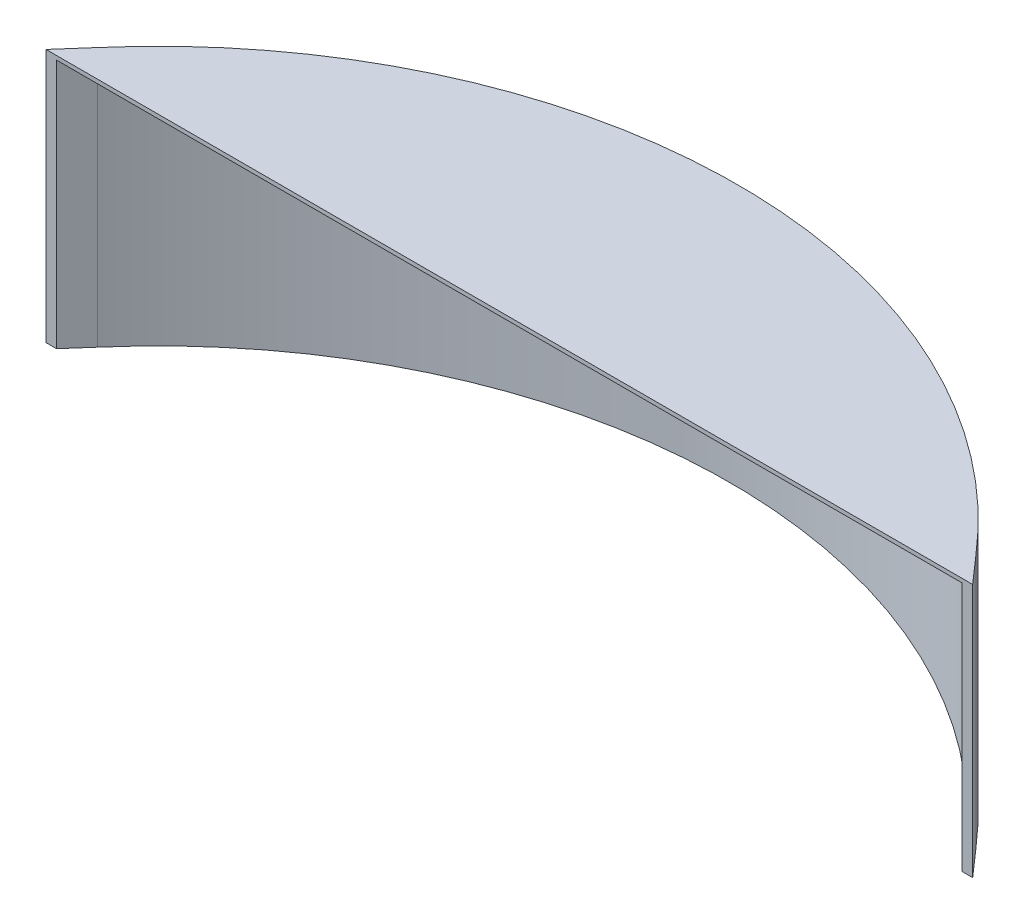
ISO-10303-21;
HEADER;
FILE_DESCRIPTION(('STEP AP214'),'2;1');
FILE_NAME('part.step','',(''),(''),'','','');
FILE_SCHEMA(('AUTOMOTIVE_DESIGN { 1 0 10303 214 1 1 1 1 }'));
ENDSEC;
DATA;
#1=APPLICATION_CONTEXT('core data for automotive mechanical design processes');
#2=APPLICATION_PROTOCOL_DEFINITION('international standard','automotive_design',2000,#1);
#3=PRODUCT_CONTEXT('',#1,'mechanical');
#4=PRODUCT('Part','Part','',(#3));
#5=PRODUCT_RELATED_PRODUCT_CATEGORY('part','',(#4));
#6=PRODUCT_DEFINITION_FORMATION('','',#4);
#7=PRODUCT_DEFINITION_CONTEXT('part definition',#1,'design');
#8=PRODUCT_DEFINITION('design','',#6,#7);
#9=PRODUCT_DEFINITION_SHAPE('','',#8);
#10=(LENGTH_UNIT() NAMED_UNIT(*) SI_UNIT(.MILLI.,.METRE.));
#11=(NAMED_UNIT(*) PLANE_ANGLE_UNIT() SI_UNIT($,.RADIAN.));
#12=(NAMED_UNIT(*) SI_UNIT($,.STERADIAN.) SOLID_ANGLE_UNIT());
#13=UNCERTAINTY_MEASURE_WITH_UNIT(LENGTH_MEASURE(1.E-05),#10,'distance_accuracy_value','');
#14=(GEOMETRIC_REPRESENTATION_CONTEXT(3) GLOBAL_UNCERTAINTY_ASSIGNED_CONTEXT((#13)) GLOBAL_UNIT_ASSIGNED_CONTEXT((#10,
#11,#12)) REPRESENTATION_CONTEXT('',''));
#15=CARTESIAN_POINT('',(0.,0.,0.));
#16=DIRECTION('',(0.,0.,1.));
#17=DIRECTION('',(1.,0.,0.));
#18=AXIS2_PLACEMENT_3D('',#15,#16,#17);
#19=CARTESIAN_POINT('',(-117.504462868261,1.,-326.15564046222));
#20=DIRECTION('',(0.,0.,-1.));
#21=DIRECTION('',(-1.,0.,0.));
#22=AXIS2_PLACEMENT_3D('',#19,#20,#21);
#23=PLANE('',#22);
#24=DIRECTION('',(0.,-1.,0.));
#25=VECTOR('',#24,1.);
#26=CARTESIAN_POINT('',(-117.504462868261,1.,-326.15564046222));
#27=LINE('',#26,#25);
#28=CARTESIAN_POINT('',(-117.504462868261,1.,-326.15564046222));
#29=VERTEX_POINT('',#28);
#30=CARTESIAN_POINT('',(-117.504462868261,-63.399999946,-326.155640462222));
#31=VERTEX_POINT('',#30);
#32=EDGE_CURVE('E98',#29,#31,#27,.T.);
#33=ORIENTED_EDGE('',*,*,#32,.T.);
#34=DIRECTION('',(-1.,0.,0.));
#35=VECTOR('',#34,1.);
#36=CARTESIAN_POINT('',(-117.504462868261,-63.399999946,-326.155640462222));
#37=LINE('',#36,#35);
#38=CARTESIAN_POINT('',(-114.840789939664,-63.399999946,-326.155640462222));
#39=VERTEX_POINT('',#38);
#40=EDGE_CURVE('E102',#39,#31,#37,.T.);
#41=ORIENTED_EDGE('',*,*,#40,.F.);
#42=DIRECTION('',(0.,1.,0.));
#43=VECTOR('',#42,1.);
#44=CARTESIAN_POINT('',(-114.840789939664,-63.399999946,-326.155640462222));
#45=LINE('',#44,#43);
#46=CARTESIAN_POINT('',(-114.840789939666,0.,-326.15564046222));
#47=VERTEX_POINT('',#46);
#48=EDGE_CURVE('E139',#39,#47,#45,.T.);
#49=ORIENTED_EDGE('',*,*,#48,.T.);
#50=DIRECTION('',(1.,0.,0.));
#51=VECTOR('',#50,1.);
#52=CARTESIAN_POINT('',(-117.504462868261,0.,-326.15564046222));
#53=LINE('',#52,#51);
#54=CARTESIAN_POINT('',(114.840789939671,0.,-326.155640462222));
#55=VERTEX_POINT('',#54);
#56=EDGE_CURVE('E152',#47,#55,#53,.T.);
#57=ORIENTED_EDGE('',*,*,#56,.T.);
#58=DIRECTION('',(0.,1.,0.));
#59=VECTOR('',#58,1.);
#60=CARTESIAN_POINT('',(114.840789939671,-63.399999946,-326.155640462222));
#61=LINE('',#60,#59);
#62=CARTESIAN_POINT('',(114.840789939671,-63.399999946,-326.155640462222));
#63=VERTEX_POINT('',#62);
#64=EDGE_CURVE('E149',#63,#55,#61,.T.);
#65=ORIENTED_EDGE('',*,*,#64,.F.);
#66=DIRECTION('',(-1.,0.,0.));
#67=VECTOR('',#66,1.);
#68=CARTESIAN_POINT('',(114.840789939671,-63.399999946,-326.155640462222));
#69=LINE('',#68,#67);
#70=CARTESIAN_POINT('',(117.504462868267,-63.399999946,-326.155640462222));
#71=VERTEX_POINT('',#70);
#72=EDGE_CURVE('E132',#71,#63,#69,.T.);
#73=ORIENTED_EDGE('',*,*,#72,.F.);
#74=DIRECTION('',(0.,-1.,0.));
#75=VECTOR('',#74,1.);
#76=CARTESIAN_POINT('',(117.504462868267,1.,-326.155640462222));
#77=LINE('',#76,#75);
#78=CARTESIAN_POINT('',(117.504462868267,1.,-326.155640462222));
#79=VERTEX_POINT('',#78);
#80=EDGE_CURVE('E11',#79,#71,#77,.T.);
#81=ORIENTED_EDGE('',*,*,#80,.F.);
#82=DIRECTION('',(1.,0.,0.));
#83=VECTOR('',#82,1.);
#84=CARTESIAN_POINT('',(-117.504462868261,1.,-326.15564046222));
#85=LINE('',#84,#83);
#86=EDGE_CURVE('E105',#29,#79,#85,.T.);
#87=ORIENTED_EDGE('',*,*,#86,.F.);
#88=EDGE_LOOP('',(#33,#41,#49,#57,#65,#73,#81,#87));
#89=FACE_BOUND('',#88,.T.);
#90=ADVANCED_FACE('F35',(#89),#23,.F.);
#91=CARTESIAN_POINT('',(117.504462868267,1.,-326.155640462222));
#92=DIRECTION('',(-0.750842935154768,0.,0.660480799666555));
#93=DIRECTION('',(0.660480799666555,0.,0.750842935154769));
#94=AXIS2_PLACEMENT_3D('',#91,#92,#93);
#95=PLANE('',#94);
#96=ORIENTED_EDGE('',*,*,#80,.T.);
#97=DIRECTION('',(0.66048079966653,0.,0.750842935154791));
#98=VECTOR('',#97,1.);
#99=CARTESIAN_POINT('',(117.504462868267,-63.399999946,-326.155640462222));
#100=LINE('',#99,#98);
#101=CARTESIAN_POINT('',(111.509184914714,-63.399999946,-332.971148343734));
#102=VERTEX_POINT('',#101);
#103=EDGE_CURVE('E129',#102,#71,#100,.T.);
#104=ORIENTED_EDGE('',*,*,#103,.F.);
#105=DIRECTION('',(0.,-1.,0.));
#106=VECTOR('',#105,1.);
#107=CARTESIAN_POINT('',(111.509184914714,1.,-332.971148343733));
#108=LINE('',#107,#106);
#109=CARTESIAN_POINT('',(111.509184914714,1.,-332.971148343733));
#110=VERTEX_POINT('',#109);
#111=EDGE_CURVE('E42',#110,#102,#108,.T.);
#112=ORIENTED_EDGE('',*,*,#111,.F.);
#113=DIRECTION('',(-0.660480799666555,0.,-0.750842935154768));
#114=VECTOR('',#113,1.);
#115=CARTESIAN_POINT('',(117.504462868267,1.,-326.155640462222));
#116=LINE('',#115,#114);
#117=EDGE_CURVE('E154',#79,#110,#116,.T.);
#118=ORIENTED_EDGE('',*,*,#117,.F.);
#119=EDGE_LOOP('',(#96,#104,#112,#118));
#120=FACE_BOUND('',#119,.T.);
#121=ADVANCED_FACE('F167',(#120),#95,.F.);
#122=CARTESIAN_POINT('',(3.59411590979661E-12,1.,-237.097909433023));
#123=DIRECTION('',(0.,-1.,0.));
#124=DIRECTION('',(0.,0.,-1.));
#125=AXIS2_PLACEMENT_3D('',#122,#123,#124);
#126=CYLINDRICAL_SURFACE('',#125,147.057731043197);
#127=ORIENTED_EDGE('',*,*,#111,.T.);
#128=CARTESIAN_POINT('',(3.60410177890761E-12,-63.399999946,-237.097909433025));
#129=DIRECTION('',(0.,-1.,0.));
#130=DIRECTION('',(0.,0.,-1.));
#131=AXIS2_PLACEMENT_3D('',#128,#129,#130);
#132=CIRCLE('',#131,147.057731043197);
#133=CARTESIAN_POINT('',(-111.509184914703,-63.399999946,-332.97114834374));
#134=VERTEX_POINT('',#133);
#135=EDGE_CURVE('E118',#134,#102,#132,.T.);
#136=ORIENTED_EDGE('',*,*,#135,.F.);
#137=DIRECTION('',(0.,-1.,0.));
#138=VECTOR('',#137,1.);
#139=CARTESIAN_POINT('',(-111.509184914703,1.,-332.971148343739));
#140=LINE('',#139,#138);
#141=CARTESIAN_POINT('',(-111.509184914703,1.,-332.971148343739));
#142=VERTEX_POINT('',#141);
#143=EDGE_CURVE('E108',#142,#134,#140,.T.);
#144=ORIENTED_EDGE('',*,*,#143,.F.);
#145=CARTESIAN_POINT('',(3.59411590979661E-12,1.,-237.097909433023));
#146=DIRECTION('',(0.,1.,0.));
#147=DIRECTION('',(0.,0.,-1.));
#148=AXIS2_PLACEMENT_3D('',#145,#146,#147);
#149=CIRCLE('',#148,147.057731043197);
#150=EDGE_CURVE('E156',#110,#142,#149,.T.);
#151=ORIENTED_EDGE('',*,*,#150,.F.);
#152=EDGE_LOOP('',(#127,#136,#144,#151));
#153=FACE_BOUND('',#152,.T.);
#154=ADVANCED_FACE('F163',(#153),#126,.T.);
#155=CARTESIAN_POINT('',(-117.504462868261,1.,-326.15564046222));
#156=DIRECTION('',(0.750842935154822,0.,0.660480799666494));
#157=DIRECTION('',(0.660480799666494,0.,-0.750842935154822));
#158=AXIS2_PLACEMENT_3D('',#155,#156,#157);
#159=PLANE('',#158);
#160=ORIENTED_EDGE('',*,*,#143,.T.);
#161=DIRECTION('',(0.660480799666557,0.,-0.750842935154766));
#162=VECTOR('',#161,1.);
#163=CARTESIAN_POINT('',(-117.504462868261,-63.399999946,-326.155640462222));
#164=LINE('',#163,#162);
#165=EDGE_CURVE('E112',#31,#134,#164,.T.);
#166=ORIENTED_EDGE('',*,*,#165,.F.);
#167=ORIENTED_EDGE('',*,*,#32,.F.);
#168=DIRECTION('',(-0.660480799666494,0.,0.750842935154822));
#169=VECTOR('',#168,1.);
#170=CARTESIAN_POINT('',(-117.504462868261,1.,-326.15564046222));
#171=LINE('',#170,#169);
#172=EDGE_CURVE('E109',#142,#29,#171,.T.);
#173=ORIENTED_EDGE('',*,*,#172,.F.);
#174=EDGE_LOOP('',(#160,#166,#167,#173));
#175=FACE_BOUND('',#174,.T.);
#176=ADVANCED_FACE('F113',(#175),#159,.F.);
#177=CARTESIAN_POINT('',(3.59411590979661E-12,1.,-237.097909433023));
#178=DIRECTION('',(0.,-1.,0.));
#179=DIRECTION('',(0.,0.,-1.));
#180=AXIS2_PLACEMENT_3D('',#177,#178,#179);
#181=PLANE('',#180);
#182=ORIENTED_EDGE('',*,*,#86,.T.);
#183=ORIENTED_EDGE('',*,*,#117,.T.);
#184=ORIENTED_EDGE('',*,*,#150,.T.);
#185=ORIENTED_EDGE('',*,*,#172,.T.);
#186=EDGE_LOOP('',(#182,#183,#184,#185));
#187=FACE_BOUND('',#186,.T.);
#188=ADVANCED_FACE('F181',(#187),#181,.F.);
#189=CARTESIAN_POINT('',(3.59411590979661E-12,0.,-237.097909433023));
#190=DIRECTION('',(0.,-1.,0.));
#191=DIRECTION('',(0.,0.,-1.));
#192=AXIS2_PLACEMENT_3D('',#189,#190,#191);
#193=PLANE('',#192);
#194=DIRECTION('',(-0.660480799666558,0.,0.750842935154766));
#195=VECTOR('',#194,1.);
#196=CARTESIAN_POINT('',(-114.840789939664,0.,-326.155640462222));
#197=LINE('',#196,#195);
#198=CARTESIAN_POINT('',(-109.999999999856,0.,-331.658711753179));
#199=VERTEX_POINT('',#198);
#200=EDGE_CURVE('E49',#199,#47,#197,.T.);
#201=ORIENTED_EDGE('',*,*,#200,.F.);
#202=CARTESIAN_POINT('',(3.60410177890761E-12,0.,-237.097909433025));
#203=DIRECTION('',(0.,1.,0.));
#204=DIRECTION('',(0.,0.,-1.));
#205=AXIS2_PLACEMENT_3D('',#202,#203,#204);
#206=CIRCLE('',#205,145.057731043197);
#207=CARTESIAN_POINT('',(109.999999999868,0.,-331.658711753173));
#208=VERTEX_POINT('',#207);
#209=EDGE_CURVE('E125',#208,#199,#206,.T.);
#210=ORIENTED_EDGE('',*,*,#209,.F.);
#211=DIRECTION('',(-0.66048079966653,0.,-0.750842935154791));
#212=VECTOR('',#211,1.);
#213=CARTESIAN_POINT('',(114.840789939671,0.,-326.155640462222));
#214=LINE('',#213,#212);
#215=EDGE_CURVE('E54',#55,#208,#214,.T.);
#216=ORIENTED_EDGE('',*,*,#215,.F.);
#217=ORIENTED_EDGE('',*,*,#56,.F.);
#218=EDGE_LOOP('',(#201,#210,#216,#217));
#219=FACE_BOUND('',#218,.T.);
#220=ADVANCED_FACE('F179',(#219),#193,.T.);
#221=CARTESIAN_POINT('',(114.840789939671,-63.399999946,-326.155640462222));
#222=DIRECTION('',(0.750842935154791,0.,-0.66048079966653));
#223=DIRECTION('',(-0.66048079966653,0.,-0.750842935154791));
#224=AXIS2_PLACEMENT_3D('',#221,#222,#223);
#225=PLANE('',#224);
#226=ORIENTED_EDGE('',*,*,#215,.T.);
#227=DIRECTION('',(0.,1.,0.));
#228=VECTOR('',#227,1.);
#229=CARTESIAN_POINT('',(109.999999999868,-63.399999946,-331.658711753173));
#230=LINE('',#229,#228);
#231=CARTESIAN_POINT('',(109.999999999868,-63.399999946,-331.658711753173));
#232=VERTEX_POINT('',#231);
#233=EDGE_CURVE('E146',#232,#208,#230,.T.);
#234=ORIENTED_EDGE('',*,*,#233,.F.);
#235=DIRECTION('',(-0.66048079966653,0.,-0.750842935154791));
#236=VECTOR('',#235,1.);
#237=CARTESIAN_POINT('',(114.840789939671,-63.399999946,-326.155640462222));
#238=LINE('',#237,#236);
#239=EDGE_CURVE('E134',#63,#232,#238,.T.);
#240=ORIENTED_EDGE('',*,*,#239,.F.);
#241=ORIENTED_EDGE('',*,*,#64,.T.);
#242=EDGE_LOOP('',(#226,#234,#240,#241));
#243=FACE_BOUND('',#242,.T.);
#244=ADVANCED_FACE('F174',(#243),#225,.F.);
#245=CARTESIAN_POINT('',(3.60410177890761E-12,-63.399999946,-237.097909433025));
#246=DIRECTION('',(0.,1.,0.));
#247=DIRECTION('',(0.,0.,1.));
#248=AXIS2_PLACEMENT_3D('',#245,#246,#247);
#249=CYLINDRICAL_SURFACE('',#248,145.057731043197);
#250=ORIENTED_EDGE('',*,*,#209,.T.);
#251=DIRECTION('',(0.,1.,0.));
#252=VECTOR('',#251,1.);
#253=CARTESIAN_POINT('',(-109.999999999856,-63.399999946,-331.658711753179));
#254=LINE('',#253,#252);
#255=CARTESIAN_POINT('',(-109.999999999856,-63.399999946,-331.658711753179));
#256=VERTEX_POINT('',#255);
#257=EDGE_CURVE('E143',#256,#199,#254,.T.);
#258=ORIENTED_EDGE('',*,*,#257,.F.);
#259=CARTESIAN_POINT('',(3.60410177890761E-12,-63.399999946,-237.097909433025));
#260=DIRECTION('',(0.,1.,0.));
#261=DIRECTION('',(0.,0.,-1.));
#262=AXIS2_PLACEMENT_3D('',#259,#260,#261);
#263=CIRCLE('',#262,145.057731043197);
#264=EDGE_CURVE('E136',#232,#256,#263,.T.);
#265=ORIENTED_EDGE('',*,*,#264,.F.);
#266=ORIENTED_EDGE('',*,*,#233,.T.);
#267=EDGE_LOOP('',(#250,#258,#265,#266));
#268=FACE_BOUND('',#267,.T.);
#269=ADVANCED_FACE('F176',(#268),#249,.F.);
#270=CARTESIAN_POINT('',(-114.840789939664,-63.399999946,-326.155640462222));
#271=DIRECTION('',(-0.750842935154766,0.,-0.660480799666558));
#272=DIRECTION('',(-0.660480799666558,0.,0.750842935154766));
#273=AXIS2_PLACEMENT_3D('',#270,#271,#272);
#274=PLANE('',#273);
#275=ORIENTED_EDGE('',*,*,#200,.T.);
#276=ORIENTED_EDGE('',*,*,#48,.F.);
#277=DIRECTION('',(-0.660480799666558,0.,0.750842935154766));
#278=VECTOR('',#277,1.);
#279=CARTESIAN_POINT('',(-114.840789939664,-63.399999946,-326.155640462222));
#280=LINE('',#279,#278);
#281=EDGE_CURVE('E122',#256,#39,#280,.T.);
#282=ORIENTED_EDGE('',*,*,#281,.F.);
#283=ORIENTED_EDGE('',*,*,#257,.T.);
#284=EDGE_LOOP('',(#275,#276,#282,#283));
#285=FACE_BOUND('',#284,.T.);
#286=ADVANCED_FACE('F178',(#285),#274,.F.);
#287=CARTESIAN_POINT('',(3.60410177890761E-12,-63.399999946,-237.097909433025));
#288=DIRECTION('',(0.,-1.,0.));
#289=DIRECTION('',(0.,0.,-1.));
#290=AXIS2_PLACEMENT_3D('',#287,#288,#289);
#291=PLANE('',#290);
#292=ORIENTED_EDGE('',*,*,#40,.T.);
#293=ORIENTED_EDGE('',*,*,#165,.T.);
#294=ORIENTED_EDGE('',*,*,#135,.T.);
#295=ORIENTED_EDGE('',*,*,#103,.T.);
#296=ORIENTED_EDGE('',*,*,#72,.T.);
#297=ORIENTED_EDGE('',*,*,#239,.T.);
#298=ORIENTED_EDGE('',*,*,#264,.T.);
#299=ORIENTED_EDGE('',*,*,#281,.T.);
#300=EDGE_LOOP('',(#292,#293,#294,#295,#296,#297,#298,#299));
#301=FACE_BOUND('',#300,.T.);
#302=ADVANCED_FACE('F120',(#301),#291,.T.);
#303=CLOSED_SHELL('',(#90,#121,#154,#176,#188,#220,#244,#269,#286,#302));
#304=MANIFOLD_SOLID_BREP('B2',#303);
#305=ADVANCED_BREP_SHAPE_REPRESENTATION('',(#18,#304),#14);
#306=SHAPE_DEFINITION_REPRESENTATION(#9,#305);
ENDSEC;
END-ISO-10303-21;
